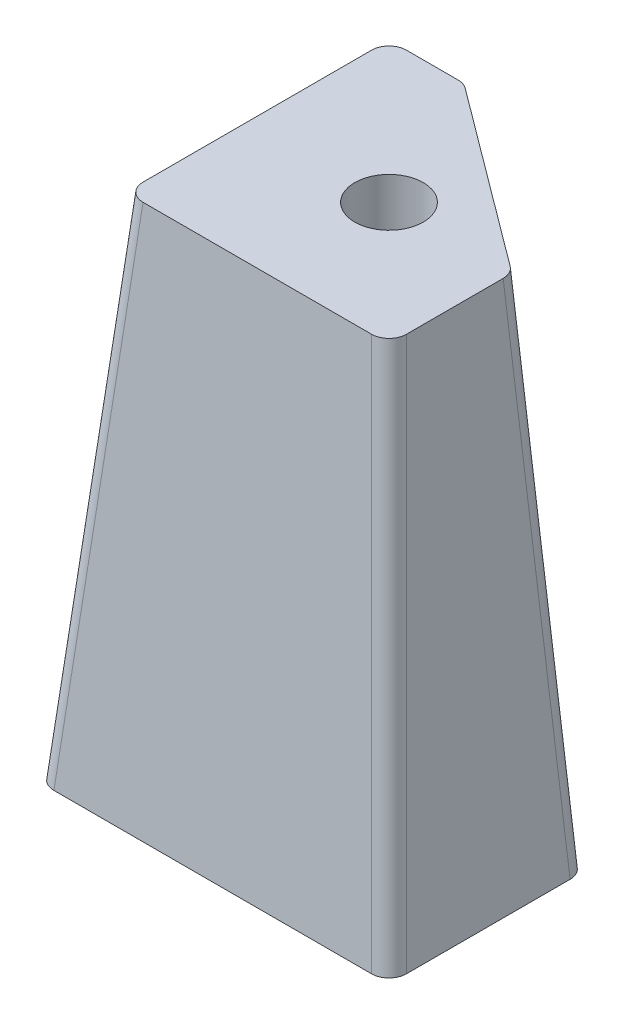
ISO-10303-21;
HEADER;
FILE_DESCRIPTION(('STEP AP214'),'2;1');
FILE_NAME('part.step','',(''),(''),'','','');
FILE_SCHEMA(('AUTOMOTIVE_DESIGN { 1 0 10303 214 1 1 1 1 }'));
ENDSEC;
DATA;
#1=APPLICATION_CONTEXT('core data for automotive mechanical design processes');
#2=APPLICATION_PROTOCOL_DEFINITION('international standard','automotive_design',2000,#1);
#3=PRODUCT_CONTEXT('',#1,'mechanical');
#4=PRODUCT('Part','Part','',(#3));
#5=PRODUCT_RELATED_PRODUCT_CATEGORY('part','',(#4));
#6=PRODUCT_DEFINITION_FORMATION('','',#4);
#7=PRODUCT_DEFINITION_CONTEXT('part definition',#1,'design');
#8=PRODUCT_DEFINITION('design','',#6,#7);
#9=PRODUCT_DEFINITION_SHAPE('','',#8);
#10=(LENGTH_UNIT() NAMED_UNIT(*) SI_UNIT(.MILLI.,.METRE.));
#11=(NAMED_UNIT(*) PLANE_ANGLE_UNIT() SI_UNIT($,.RADIAN.));
#12=(NAMED_UNIT(*) SI_UNIT($,.STERADIAN.) SOLID_ANGLE_UNIT());
#13=UNCERTAINTY_MEASURE_WITH_UNIT(LENGTH_MEASURE(1.E-05),#10,'distance_accuracy_value','');
#14=(GEOMETRIC_REPRESENTATION_CONTEXT(3) GLOBAL_UNCERTAINTY_ASSIGNED_CONTEXT((#13)) GLOBAL_UNIT_ASSIGNED_CONTEXT((#10,
#11,#12)) REPRESENTATION_CONTEXT('',''));
#15=CARTESIAN_POINT('',(0.,0.,0.));
#16=DIRECTION('',(0.,0.,1.));
#17=DIRECTION('',(1.,0.,0.));
#18=AXIS2_PLACEMENT_3D('',#15,#16,#17);
#19=CARTESIAN_POINT('',(-4.57964601769912,29.,-7.79867256637168));
#20=DIRECTION('',(0.,0.0871557427476584,-0.996194698091746));
#21=DIRECTION('',(0.,0.996194698091746,0.0871557427476584));
#22=AXIS2_PLACEMENT_3D('',#19,#20,#21);
#23=PLANE('',#22);
#24=DIRECTION('',(1.,0.,0.));
#25=VECTOR('',#24,1.);
#26=CARTESIAN_POINT('',(0.,0.,-10.3358438086235));
#27=LINE('',#26,#25);
#28=CARTESIAN_POINT('',(0.198652130958483,0.,-10.3358438086235));
#29=VERTEX_POINT('',#28);
#30=CARTESIAN_POINT('',(-6.12062256185917,0.,-10.3358438086235));
#31=VERTEX_POINT('',#30);
#32=EDGE_CURVE('E162',#29,#31,#27,.F.);
#33=ORIENTED_EDGE('',*,*,#32,.T.);
#34=DIRECTION('',(0.0868265938642478,0.992432509138967,0.0868265938642478));
#35=VECTOR('',#34,1.);
#36=CARTESIAN_POINT('',(-3.59096148938098,28.914158366685,-7.80618273614529));
#37=LINE('',#36,#35);
#38=CARTESIAN_POINT('',(-3.58345131960737,29.,-7.79867256637168));
#39=VERTEX_POINT('',#38);
#40=EDGE_CURVE('E211',#31,#39,#37,.T.);
#41=ORIENTED_EDGE('',*,*,#40,.T.);
#42=DIRECTION('',(-1.,0.,0.));
#43=VECTOR('',#42,1.);
#44=CARTESIAN_POINT('',(-4.57964601769912,29.,-7.79867256637168));
#45=LINE('',#44,#43);
#46=CARTESIAN_POINT('',(-0.642894007927864,29.,-7.79867256637168));
#47=VERTEX_POINT('',#46);
#48=EDGE_CURVE('E222',#47,#39,#45,.T.);
#49=ORIENTED_EDGE('',*,*,#48,.F.);
#50=DIRECTION('',(-0.0288963352029624,0.995778700850393,0.0871193477049819));
#51=VECTOR('',#50,1.);
#52=CARTESIAN_POINT('',(-0.646181188723265,29.113277500379,-7.78876206925596));
#53=LINE('',#52,#51);
#54=EDGE_CURVE('E206',#47,#29,#53,.F.);
#55=ORIENTED_EDGE('',*,*,#54,.T.);
#56=EDGE_LOOP('',(#33,#41,#49,#55));
#57=FACE_BOUND('',#56,.T.);
#58=ADVANCED_FACE('F44',(#57),#23,.T.);
#59=CARTESIAN_POINT('',(-4.57964601769912,29.,7.20132743362832));
#60=DIRECTION('',(-0.996194698091746,0.0871557427476584,0.));
#61=DIRECTION('',(0.0871557427476584,0.996194698091746,0.));
#62=AXIS2_PLACEMENT_3D('',#59,#60,#61);
#63=PLANE('',#62);
#64=DIRECTION('',(0.,0.,-1.));
#65=VECTOR('',#64,1.);
#66=CARTESIAN_POINT('',(-7.11681725995092,0.,0.));
#67=LINE('',#66,#65);
#68=CARTESIAN_POINT('',(-7.11681725995092,0.,-9.33964911053174));
#69=VERTEX_POINT('',#68);
#70=CARTESIAN_POINT('',(-7.11681725995092,0.,8.74230397778837));
#71=VERTEX_POINT('',#70);
#72=EDGE_CURVE('E155',#69,#71,#67,.F.);
#73=ORIENTED_EDGE('',*,*,#72,.T.);
#74=DIRECTION('',(0.0868265938642478,0.992432509138967,-0.0868265938642478));
#75=VECTOR('',#74,1.);
#76=CARTESIAN_POINT('',(-4.58715618747273,28.914158366685,6.21264290531018));
#77=LINE('',#76,#75);
#78=CARTESIAN_POINT('',(-4.57964601769912,29.,6.20513273553657));
#79=VERTEX_POINT('',#78);
#80=EDGE_CURVE('E130',#71,#79,#77,.T.);
#81=ORIENTED_EDGE('',*,*,#80,.T.);
#82=DIRECTION('',(0.,0.,1.));
#83=VECTOR('',#82,1.);
#84=CARTESIAN_POINT('',(-4.57964601769912,29.,7.20132743362832));
#85=LINE('',#84,#83);
#86=CARTESIAN_POINT('',(-4.57964601769912,29.,-6.80247786827994));
#87=VERTEX_POINT('',#86);
#88=EDGE_CURVE('E228',#87,#79,#85,.T.);
#89=ORIENTED_EDGE('',*,*,#88,.F.);
#90=DIRECTION('',(0.0868265938642478,0.992432509138967,0.0868265938642478));
#91=VECTOR('',#90,1.);
#92=CARTESIAN_POINT('',(-4.47407332644172,30.2067013828153,-6.69690517702254));
#93=LINE('',#92,#91);
#94=EDGE_CURVE('E133',#87,#69,#93,.F.);
#95=ORIENTED_EDGE('',*,*,#94,.T.);
#96=EDGE_LOOP('',(#73,#81,#89,#95));
#97=FACE_BOUND('',#96,.T.);
#98=ADVANCED_FACE('F276',(#97),#63,.T.);
#99=CARTESIAN_POINT('',(10.4203539823009,29.,7.20132743362832));
#100=DIRECTION('',(0.,0.0871557427476584,0.996194698091746));
#101=DIRECTION('',(0.,0.996194698091746,-0.0871557427476584));
#102=AXIS2_PLACEMENT_3D('',#99,#100,#101);
#103=PLANE('',#102);
#104=DIRECTION('',(1.,0.,0.));
#105=VECTOR('',#104,1.);
#106=CARTESIAN_POINT('',(10.4203539823009,29.,7.20132743362832));
#107=LINE('',#106,#105);
#108=CARTESIAN_POINT('',(-3.58345131960737,29.,7.20132743362832));
#109=VERTEX_POINT('',#108);
#110=CARTESIAN_POINT('',(9.42415928420914,29.,7.20132743362832));
#111=VERTEX_POINT('',#110);
#112=EDGE_CURVE('E144',#109,#111,#107,.T.);
#113=ORIENTED_EDGE('',*,*,#112,.F.);
#114=DIRECTION('',(0.0868265938642478,0.992432509138967,-0.0868265938642478));
#115=VECTOR('',#114,1.);
#116=CARTESIAN_POINT('',(-3.47787862834998,30.2067013828153,7.09575474237092));
#117=LINE('',#116,#115);
#118=CARTESIAN_POINT('',(-6.12062256185918,0.,9.73849867588012));
#119=VERTEX_POINT('',#118);
#120=EDGE_CURVE('E126',#109,#119,#117,.F.);
#121=ORIENTED_EDGE('',*,*,#120,.T.);
#122=DIRECTION('',(-1.,0.,0.));
#123=VECTOR('',#122,1.);
#124=CARTESIAN_POINT('',(0.,0.,9.73849867588012));
#125=LINE('',#124,#123);
#126=CARTESIAN_POINT('',(11.9613305264609,0.,9.73849867588012));
#127=VERTEX_POINT('',#126);
#128=EDGE_CURVE('E142',#119,#127,#125,.F.);
#129=ORIENTED_EDGE('',*,*,#128,.T.);
#130=DIRECTION('',(-0.0868265938642478,0.992432509138967,-0.0868265938642478));
#131=VECTOR('',#130,1.);
#132=CARTESIAN_POINT('',(9.43166945398275,28.914158366685,7.20883760340192));
#133=LINE('',#132,#131);
#134=EDGE_CURVE('E146',#127,#111,#133,.T.);
#135=ORIENTED_EDGE('',*,*,#134,.T.);
#136=EDGE_LOOP('',(#113,#121,#129,#135));
#137=FACE_BOUND('',#136,.T.);
#138=ADVANCED_FACE('F138',(#137),#103,.T.);
#139=CARTESIAN_POINT('',(10.4203539823009,29.,0.201327433628314));
#140=DIRECTION('',(0.996194698091746,0.0871557427476584,0.));
#141=DIRECTION('',(-0.0871557427476584,0.996194698091746,0.));
#142=AXIS2_PLACEMENT_3D('',#139,#140,#141);
#143=PLANE('',#142);
#144=DIRECTION('',(0.,0.,-1.));
#145=VECTOR('',#144,1.);
#146=CARTESIAN_POINT('',(10.4203539823009,29.,0.201327433628314));
#147=LINE('',#146,#145);
#148=CARTESIAN_POINT('',(10.4203539823009,29.,6.20513273553657));
#149=VERTEX_POINT('',#148);
#150=CARTESIAN_POINT('',(10.4203539823009,29.,0.701272397167975));
#151=VERTEX_POINT('',#150);
#152=EDGE_CURVE('E233',#149,#151,#147,.T.);
#153=ORIENTED_EDGE('',*,*,#152,.F.);
#154=DIRECTION('',(-0.0868265938642478,0.992432509138967,-0.0868265938642478));
#155=VECTOR('',#154,1.);
#156=CARTESIAN_POINT('',(10.37509215026,29.5173451075458,6.15987090349571));
#157=LINE('',#156,#155);
#158=CARTESIAN_POINT('',(12.9575252245527,0.,8.74230397778837));
#159=VERTEX_POINT('',#158);
#160=EDGE_CURVE('E201',#149,#159,#157,.F.);
#161=ORIENTED_EDGE('',*,*,#160,.T.);
#162=DIRECTION('',(0.,0.,1.));
#163=VECTOR('',#162,1.);
#164=CARTESIAN_POINT('',(12.9575252245527,0.,0.));
#165=LINE('',#164,#163);
#166=CARTESIAN_POINT('',(12.9575252245527,0.,-0.572018844625643));
#167=VERTEX_POINT('',#166);
#168=EDGE_CURVE('E151',#159,#167,#165,.F.);
#169=ORIENTED_EDGE('',*,*,#168,.T.);
#170=DIRECTION('',(-0.0870724913818913,0.995243130626751,0.0436977366097346));
#171=VECTOR('',#170,1.);
#172=CARTESIAN_POINT('',(10.4222562082914,28.9782574574362,0.700317756167258));
#173=LINE('',#172,#171);
#174=EDGE_CURVE('E202',#167,#151,#173,.T.);
#175=ORIENTED_EDGE('',*,*,#174,.T.);
#176=EDGE_LOOP('',(#153,#161,#169,#175));
#177=FACE_BOUND('',#176,.T.);
#178=ADVANCED_FACE('F301',(#177),#143,.T.);
#179=CARTESIAN_POINT('',(-0.312469404417813,29.,-7.79867256637168));
#180=DIRECTION('',(0.595351002863312,0.0871557427476584,-0.798724645854723));
#181=DIRECTION('',(-0.0520864635693298,0.996194698091746,0.0698793517910468));
#182=AXIS2_PLACEMENT_3D('',#179,#180,#181);
#183=PLANE('',#182);
#184=DIRECTION('',(0.801775644243756,0.,0.597625146975519));
#185=VECTOR('',#184,1.);
#186=CARTESIAN_POINT('',(5.1414990569579,0.,-6.89785016516374));
#187=LINE('',#186,#185);
#188=CARTESIAN_POINT('',(12.5566815293242,0.,-1.37074349048036));
#189=VERTEX_POINT('',#188);
#190=CARTESIAN_POINT('',(0.794003133821794,0.,-10.1383737563865));
#191=VERTEX_POINT('',#190);
#192=EDGE_CURVE('E156',#189,#191,#187,.F.);
#193=ORIENTED_EDGE('',*,*,#192,.T.);
#194=DIRECTION('',(-0.0288963352029624,0.995778700850393,0.0871193477049819));
#195=VECTOR('',#194,1.);
#196=CARTESIAN_POINT('',(-0.0472671011192974,28.9904922451157,-7.60203433490262));
#197=LINE('',#196,#195);
#198=CARTESIAN_POINT('',(-0.0475430050645527,29.,-7.60120251413466));
#199=VERTEX_POINT('',#198);
#200=EDGE_CURVE('E11',#191,#199,#197,.T.);
#201=ORIENTED_EDGE('',*,*,#200,.T.);
#202=DIRECTION('',(-0.801775644243756,0.,-0.597625146975519));
#203=VECTOR('',#202,1.);
#204=CARTESIAN_POINT('',(-0.312469404417813,29.,-7.79867256637168));
#205=LINE('',#204,#203);
#206=CARTESIAN_POINT('',(10.0195102870724,29.,-0.097452248686747));
#207=VERTEX_POINT('',#206);
#208=EDGE_CURVE('E171',#207,#199,#205,.T.);
#209=ORIENTED_EDGE('',*,*,#208,.F.);
#210=DIRECTION('',(-0.0870724913818913,0.995243130626751,0.0436977366097346));
#211=VECTOR('',#210,1.);
#212=CARTESIAN_POINT('',(9.97047930433021,29.5604266971996,-0.0728458209208324));
#213=LINE('',#212,#211);
#214=EDGE_CURVE('E53',#207,#189,#213,.F.);
#215=ORIENTED_EDGE('',*,*,#214,.T.);
#216=EDGE_LOOP('',(#193,#201,#209,#215));
#217=FACE_BOUND('',#216,.T.);
#218=ADVANCED_FACE('F216',(#217),#183,.T.);
#219=CARTESIAN_POINT('',(0.,29.,0.));
#220=DIRECTION('',(0.,-1.,0.));
#221=DIRECTION('',(0.,0.,-1.));
#222=AXIS2_PLACEMENT_3D('',#219,#220,#221);
#223=PLANE('',#222);
#224=CARTESIAN_POINT('',(3.42035398230088,29.,0.201327433628316));
#225=DIRECTION('',(0.,1.,0.));
#226=DIRECTION('',(0.,0.,1.));
#227=AXIS2_PLACEMENT_3D('',#224,#225,#226);
#228=CIRCLE('',#227,1.95);
#229=CARTESIAN_POINT('',(3.42035398230088,29.,2.15132743362832));
#230=VERTEX_POINT('',#229);
#231=EDGE_CURVE('E251',#230,#230,#228,.T.);
#232=ORIENTED_EDGE('',*,*,#231,.F.);
#233=EDGE_LOOP('',(#232));
#234=FACE_BOUND('',#233,.T.);
#235=ORIENTED_EDGE('',*,*,#88,.T.);
#236=CARTESIAN_POINT('',(-3.57582618015577,29.,6.19750759608497));
#237=DIRECTION('',(0.,-1.,0.));
#238=DIRECTION('',(-0.707106781186548,0.,0.707106781186548));
#239=AXIS2_PLACEMENT_3D('',#236,#237,#238);
#240=ELLIPSE('',#239,1.00762519445035,1.);
#241=EDGE_CURVE('E200',#79,#109,#240,.F.);
#242=ORIENTED_EDGE('',*,*,#241,.T.);
#243=ORIENTED_EDGE('',*,*,#112,.T.);
#244=CARTESIAN_POINT('',(9.41653414475753,29.,6.19750759608497));
#245=DIRECTION('',(0.,-1.,0.));
#246=DIRECTION('',(0.707106781186547,0.,0.707106781186548));
#247=AXIS2_PLACEMENT_3D('',#244,#245,#246);
#248=ELLIPSE('',#247,1.00762519445035,1.);
#249=EDGE_CURVE('E192',#111,#149,#248,.F.);
#250=ORIENTED_EDGE('',*,*,#249,.T.);
#251=ORIENTED_EDGE('',*,*,#152,.T.);
#252=CARTESIAN_POINT('',(9.41653414475753,29.,0.70509910902703));
#253=DIRECTION('',(0.,-1.,0.));
#254=DIRECTION('',(0.893763152903363,0.,-0.448539214018396));
#255=AXIS2_PLACEMENT_3D('',#252,#253,#254);
#256=ELLIPSE('',#255,1.00477960533147,1.);
#257=EDGE_CURVE('E69',#151,#207,#256,.F.);
#258=ORIENTED_EDGE('',*,*,#257,.T.);
#259=ORIENTED_EDGE('',*,*,#208,.T.);
#260=CARTESIAN_POINT('',(-0.645423165817211,29.,-6.79485272882833));
#261=DIRECTION('',(0.,-1.,0.));
#262=DIRECTION('',(0.314820866332145,0.,-0.949151106053129));
#263=AXIS2_PLACEMENT_3D('',#260,#261,#262);
#264=ELLIPSE('',#263,1.00423919405587,1.);
#265=EDGE_CURVE('E186',#199,#47,#264,.F.);
#266=ORIENTED_EDGE('',*,*,#265,.T.);
#267=ORIENTED_EDGE('',*,*,#48,.T.);
#268=CARTESIAN_POINT('',(-3.57582618015577,29.,-6.79485272882834));
#269=DIRECTION('',(0.,-1.,0.));
#270=DIRECTION('',(-0.707106781186547,0.,-0.707106781186548));
#271=AXIS2_PLACEMENT_3D('',#268,#269,#270);
#272=ELLIPSE('',#271,1.00762519445035,1.);
#273=EDGE_CURVE('E191',#39,#87,#272,.F.);
#274=ORIENTED_EDGE('',*,*,#273,.T.);
#275=EDGE_LOOP('',(#235,#242,#243,#250,#251,#258,#259,#266,#267,#274));
#276=FACE_BOUND('',#275,.T.);
#277=ADVANCED_FACE('F268',(#234,#276),#223,.F.);
#278=CARTESIAN_POINT('',(0.,0.,0.));
#279=DIRECTION('',(0.,-1.,0.));
#280=DIRECTION('',(0.,0.,-1.));
#281=AXIS2_PLACEMENT_3D('',#278,#279,#280);
#282=PLANE('',#281);
#283=CARTESIAN_POINT('',(-0.579646017699118,0.,2.20132743362832));
#284=DIRECTION('',(0.,-1.,0.));
#285=DIRECTION('',(0.,0.,-1.));
#286=AXIS2_PLACEMENT_3D('',#283,#284,#285);
#287=CIRCLE('',#286,2.);
#288=CARTESIAN_POINT('',(-0.579646017699118,0.,0.201327433628316));
#289=VERTEX_POINT('',#288);
#290=EDGE_CURVE('E250',#289,#289,#287,.T.);
#291=ORIENTED_EDGE('',*,*,#290,.F.);
#292=EDGE_LOOP('',(#291));
#293=FACE_BOUND('',#292,.T.);
#294=CARTESIAN_POINT('',(7.42035398230088,0.,2.20132743362832));
#295=DIRECTION('',(0.,-1.,0.));
#296=DIRECTION('',(0.,0.,-1.));
#297=AXIS2_PLACEMENT_3D('',#294,#295,#296);
#298=CIRCLE('',#297,1.5);
#299=CARTESIAN_POINT('',(7.42035398230088,0.,0.701327433628317));
#300=VERTEX_POINT('',#299);
#301=EDGE_CURVE('E245',#300,#300,#298,.T.);
#302=ORIENTED_EDGE('',*,*,#301,.F.);
#303=EDGE_LOOP('',(#302));
#304=FACE_BOUND('',#303,.T.);
#305=ORIENTED_EDGE('',*,*,#128,.F.);
#306=CARTESIAN_POINT('',(-6.11299742240757,0.,8.73467883833677));
#307=DIRECTION('',(0.,-1.,0.));
#308=DIRECTION('',(-0.707106781186548,0.,0.707106781186548));
#309=AXIS2_PLACEMENT_3D('',#306,#307,#308);
#310=ELLIPSE('',#309,1.00762519445035,1.);
#311=EDGE_CURVE('E124',#119,#71,#310,.T.);
#312=ORIENTED_EDGE('',*,*,#311,.T.);
#313=ORIENTED_EDGE('',*,*,#72,.F.);
#314=CARTESIAN_POINT('',(-6.11299742240757,0.,-9.33202397108014));
#315=DIRECTION('',(0.,-1.,0.));
#316=DIRECTION('',(-0.707106781186547,0.,-0.707106781186548));
#317=AXIS2_PLACEMENT_3D('',#314,#315,#316);
#318=ELLIPSE('',#317,1.00762519445035,1.);
#319=EDGE_CURVE('E178',#69,#31,#318,.T.);
#320=ORIENTED_EDGE('',*,*,#319,.T.);
#321=ORIENTED_EDGE('',*,*,#32,.F.);
#322=CARTESIAN_POINT('',(0.196122973069135,0.,-9.33202397108013));
#323=DIRECTION('',(0.,-1.,0.));
#324=DIRECTION('',(0.314820866332145,0.,-0.949151106053129));
#325=AXIS2_PLACEMENT_3D('',#322,#323,#324);
#326=ELLIPSE('',#325,1.00423919405587,1.);
#327=EDGE_CURVE('E174',#29,#191,#326,.T.);
#328=ORIENTED_EDGE('',*,*,#327,.T.);
#329=ORIENTED_EDGE('',*,*,#192,.F.);
#330=CARTESIAN_POINT('',(11.9537053870093,0.,-0.568192132766588));
#331=DIRECTION('',(0.,-1.,0.));
#332=DIRECTION('',(0.893763152903363,0.,-0.448539214018396));
#333=AXIS2_PLACEMENT_3D('',#330,#331,#332);
#334=ELLIPSE('',#333,1.00477960533147,1.);
#335=EDGE_CURVE('E149',#189,#167,#334,.T.);
#336=ORIENTED_EDGE('',*,*,#335,.T.);
#337=ORIENTED_EDGE('',*,*,#168,.F.);
#338=CARTESIAN_POINT('',(11.9537053870093,0.,8.73467883833677));
#339=DIRECTION('',(0.,-1.,0.));
#340=DIRECTION('',(0.707106781186547,0.,0.707106781186548));
#341=AXIS2_PLACEMENT_3D('',#338,#339,#340);
#342=ELLIPSE('',#341,1.00762519445035,1.);
#343=EDGE_CURVE('E132',#159,#127,#342,.T.);
#344=ORIENTED_EDGE('',*,*,#343,.T.);
#345=EDGE_LOOP('',(#305,#312,#313,#320,#321,#328,#329,#336,#337,#344));
#346=FACE_BOUND('',#345,.T.);
#347=ADVANCED_FACE('F148',(#293,#304,#346),#282,.T.);
#348=CARTESIAN_POINT('',(7.42035398230088,10.,2.20132743362832));
#349=DIRECTION('',(0.,-1.,0.));
#350=DIRECTION('',(0.,0.,-1.));
#351=AXIS2_PLACEMENT_3D('',#348,#349,#350);
#352=CYLINDRICAL_SURFACE('',#351,1.5);
#353=CARTESIAN_POINT('',(7.42035398230088,10.,2.20132743362832));
#354=DIRECTION('',(0.,-1.,0.));
#355=DIRECTION('',(0.,0.,-1.));
#356=AXIS2_PLACEMENT_3D('',#353,#354,#355);
#357=CIRCLE('',#356,1.5);
#358=CARTESIAN_POINT('',(7.42035398230088,10.,0.701327433628317));
#359=VERTEX_POINT('',#358);
#360=EDGE_CURVE('E238',#359,#359,#357,.T.);
#361=ORIENTED_EDGE('',*,*,#360,.F.);
#362=EDGE_LOOP('',(#361));
#363=FACE_BOUND('',#362,.T.);
#364=ORIENTED_EDGE('',*,*,#301,.T.);
#365=EDGE_LOOP('',(#364));
#366=FACE_BOUND('',#365,.T.);
#367=ADVANCED_FACE('F386',(#363,#366),#352,.F.);
#368=CARTESIAN_POINT('',(7.42035398230088,10.,2.20132743362832));
#369=DIRECTION('',(0.,-1.,0.));
#370=DIRECTION('',(0.,0.,-1.));
#371=AXIS2_PLACEMENT_3D('',#368,#369,#370);
#372=PLANE('',#371);
#373=ORIENTED_EDGE('',*,*,#360,.T.);
#374=EDGE_LOOP('',(#373));
#375=FACE_BOUND('',#374,.T.);
#376=ADVANCED_FACE('F380',(#375),#372,.T.);
#377=CARTESIAN_POINT('',(-0.579646017699118,10.,2.20132743362832));
#378=DIRECTION('',(0.,-1.,0.));
#379=DIRECTION('',(0.,0.,-1.));
#380=AXIS2_PLACEMENT_3D('',#377,#378,#379);
#381=CYLINDRICAL_SURFACE('',#380,2.);
#382=CARTESIAN_POINT('',(-0.579646017699118,10.,2.20132743362832));
#383=DIRECTION('',(0.,-1.,0.));
#384=DIRECTION('',(0.,0.,-1.));
#385=AXIS2_PLACEMENT_3D('',#382,#383,#384);
#386=CIRCLE('',#385,2.);
#387=CARTESIAN_POINT('',(-0.579646017699118,10.,0.201327433628316));
#388=VERTEX_POINT('',#387);
#389=EDGE_CURVE('E169',#388,#388,#386,.T.);
#390=ORIENTED_EDGE('',*,*,#389,.F.);
#391=EDGE_LOOP('',(#390));
#392=FACE_BOUND('',#391,.T.);
#393=ORIENTED_EDGE('',*,*,#290,.T.);
#394=EDGE_LOOP('',(#393));
#395=FACE_BOUND('',#394,.T.);
#396=ADVANCED_FACE('F370',(#392,#395),#381,.F.);
#397=CARTESIAN_POINT('',(-0.579646017699118,10.,2.20132743362832));
#398=DIRECTION('',(0.,-1.,0.));
#399=DIRECTION('',(0.,0.,-1.));
#400=AXIS2_PLACEMENT_3D('',#397,#398,#399);
#401=PLANE('',#400);
#402=ORIENTED_EDGE('',*,*,#389,.T.);
#403=EDGE_LOOP('',(#402));
#404=FACE_BOUND('',#403,.T.);
#405=ADVANCED_FACE('F267',(#404),#401,.T.);
#406=CARTESIAN_POINT('',(3.42035398230088,23.,0.201327433628316));
#407=DIRECTION('',(0.,1.,0.));
#408=DIRECTION('',(0.,0.,1.));
#409=AXIS2_PLACEMENT_3D('',#406,#407,#408);
#410=CYLINDRICAL_SURFACE('',#409,1.95);
#411=CARTESIAN_POINT('',(3.42035398230088,23.,0.201327433628316));
#412=DIRECTION('',(0.,1.,0.));
#413=DIRECTION('',(0.,0.,1.));
#414=AXIS2_PLACEMENT_3D('',#411,#412,#413);
#415=CIRCLE('',#414,1.95);
#416=CARTESIAN_POINT('',(3.42035398230088,23.,2.15132743362832));
#417=VERTEX_POINT('',#416);
#418=EDGE_CURVE('E243',#417,#417,#415,.T.);
#419=ORIENTED_EDGE('',*,*,#418,.F.);
#420=EDGE_LOOP('',(#419));
#421=FACE_BOUND('',#420,.T.);
#422=ORIENTED_EDGE('',*,*,#231,.T.);
#423=EDGE_LOOP('',(#422));
#424=FACE_BOUND('',#423,.T.);
#425=ADVANCED_FACE('F265',(#421,#424),#410,.F.);
#426=CARTESIAN_POINT('',(3.42035398230088,23.,0.201327433628316));
#427=DIRECTION('',(0.,1.,0.));
#428=DIRECTION('',(0.,0.,1.));
#429=AXIS2_PLACEMENT_3D('',#426,#427,#428);
#430=PLANE('',#429);
#431=ORIENTED_EDGE('',*,*,#418,.T.);
#432=EDGE_LOOP('',(#431));
#433=FACE_BOUND('',#432,.T.);
#434=ADVANCED_FACE('F264',(#433),#430,.T.);
#435=CARTESIAN_POINT('',(-3.47787862834998,30.1195456400677,6.09956004427917));
#436=DIRECTION('',(-0.0868265938642478,-0.992432509138967,0.0868265938642478));
#437=DIRECTION('',(0.,-0.0871557427476584,-0.996194698091746));
#438=AXIS2_PLACEMENT_3D('',#435,#436,#437);
#439=CYLINDRICAL_SURFACE('',#438,1.);
#440=ORIENTED_EDGE('',*,*,#241,.F.);
#441=ORIENTED_EDGE('',*,*,#80,.F.);
#442=ORIENTED_EDGE('',*,*,#311,.F.);
#443=ORIENTED_EDGE('',*,*,#120,.F.);
#444=EDGE_LOOP('',(#440,#441,#442,#443));
#445=FACE_BOUND('',#444,.T.);
#446=ADVANCED_FACE('F129',(#445),#439,.T.);
#447=CARTESIAN_POINT('',(9.37889745216828,29.4301893647982,6.15987090349571));
#448=DIRECTION('',(0.0868265938642478,-0.992432509138967,0.0868265938642478));
#449=DIRECTION('',(0.,-0.0871557427476584,-0.996194698091746));
#450=AXIS2_PLACEMENT_3D('',#447,#448,#449);
#451=CYLINDRICAL_SURFACE('',#450,1.);
#452=ORIENTED_EDGE('',*,*,#249,.F.);
#453=ORIENTED_EDGE('',*,*,#134,.F.);
#454=ORIENTED_EDGE('',*,*,#343,.F.);
#455=ORIENTED_EDGE('',*,*,#160,.F.);
#456=EDGE_LOOP('',(#452,#453,#454,#455));
#457=FACE_BOUND('',#456,.T.);
#458=ADVANCED_FACE('F293',(#457),#451,.T.);
#459=CARTESIAN_POINT('',(-3.47787862834998,30.1195456400677,-6.69690517702254));
#460=DIRECTION('',(-0.0868265938642478,-0.992432509138967,-0.0868265938642478));
#461=DIRECTION('',(0.,0.0871557427476584,-0.996194698091746));
#462=AXIS2_PLACEMENT_3D('',#459,#460,#461);
#463=CYLINDRICAL_SURFACE('',#462,1.);
#464=ORIENTED_EDGE('',*,*,#273,.F.);
#465=ORIENTED_EDGE('',*,*,#40,.F.);
#466=ORIENTED_EDGE('',*,*,#319,.F.);
#467=ORIENTED_EDGE('',*,*,#94,.F.);
#468=EDGE_LOOP('',(#464,#465,#466,#467));
#469=FACE_BOUND('',#468,.T.);
#470=ADVANCED_FACE('F278',(#469),#463,.T.);
#471=CARTESIAN_POINT('',(-0.646181188723266,29.0261217576314,-6.79256737116422));
#472=DIRECTION('',(0.0288963352029624,-0.995778700850393,-0.087119347704982));
#473=DIRECTION('',(0.,0.0871557427476583,-0.996194698091745));
#474=AXIS2_PLACEMENT_3D('',#471,#472,#473);
#475=CYLINDRICAL_SURFACE('',#474,1.);
#476=ORIENTED_EDGE('',*,*,#265,.F.);
#477=ORIENTED_EDGE('',*,*,#200,.F.);
#478=ORIENTED_EDGE('',*,*,#327,.F.);
#479=ORIENTED_EDGE('',*,*,#54,.F.);
#480=EDGE_LOOP('',(#476,#477,#478,#479));
#481=FACE_BOUND('',#480,.T.);
#482=ADVANCED_FACE('F287',(#481),#475,.T.);
#483=CARTESIAN_POINT('',(9.3751283014669,29.4732709544519,0.72587882493389));
#484=DIRECTION('',(0.0870724913818913,-0.995243130626751,-0.0436977366097346));
#485=DIRECTION('',(0.996194698091746,0.0871557427476584,0.));
#486=AXIS2_PLACEMENT_3D('',#483,#484,#485);
#487=CYLINDRICAL_SURFACE('',#486,1.);
#488=ORIENTED_EDGE('',*,*,#257,.F.);
#489=ORIENTED_EDGE('',*,*,#174,.F.);
#490=ORIENTED_EDGE('',*,*,#335,.F.);
#491=ORIENTED_EDGE('',*,*,#214,.F.);
#492=EDGE_LOOP('',(#488,#489,#490,#491));
#493=FACE_BOUND('',#492,.T.);
#494=ADVANCED_FACE('F50',(#493),#487,.T.);
#495=CLOSED_SHELL('',(#58,#98,#138,#178,#218,#277,#347,#367,#376,#396,#405,#425,#434,#446,#458,
#470,#482,#494));
#496=MANIFOLD_SOLID_BREP('B2',#495);
#497=ADVANCED_BREP_SHAPE_REPRESENTATION('',(#18,#496),#14);
#498=SHAPE_DEFINITION_REPRESENTATION(#9,#497);
ENDSEC;
END-ISO-10303-21;
